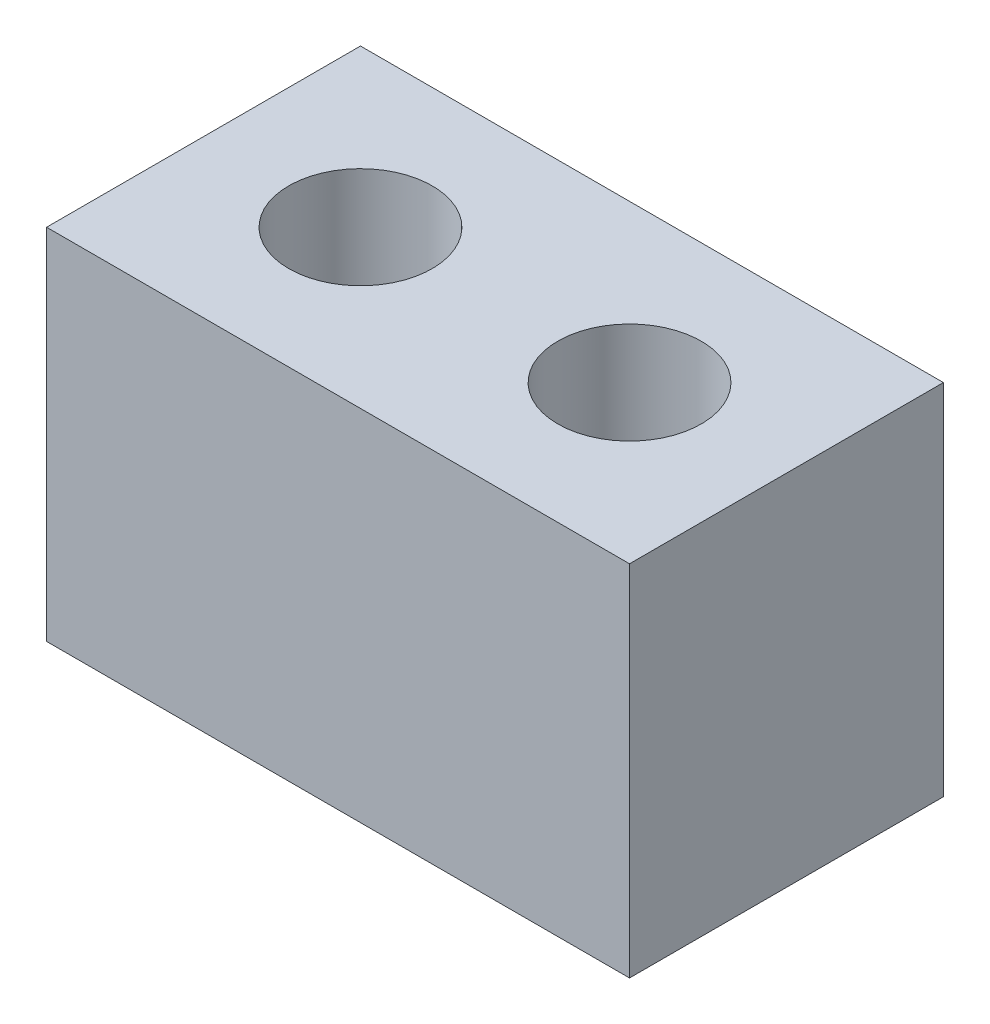
ISO-10303-21;
HEADER;
FILE_DESCRIPTION(('STEP AP214'),'2;1');
FILE_NAME('part.step','',(''),(''),'','','');
FILE_SCHEMA(('AUTOMOTIVE_DESIGN { 1 0 10303 214 1 1 1 1 }'));
ENDSEC;
DATA;
#1=APPLICATION_CONTEXT('core data for automotive mechanical design processes');
#2=APPLICATION_PROTOCOL_DEFINITION('international standard','automotive_design',2000,#1);
#3=PRODUCT_CONTEXT('',#1,'mechanical');
#4=PRODUCT('Part','Part','',(#3));
#5=PRODUCT_RELATED_PRODUCT_CATEGORY('part','',(#4));
#6=PRODUCT_DEFINITION_FORMATION('','',#4);
#7=PRODUCT_DEFINITION_CONTEXT('part definition',#1,'design');
#8=PRODUCT_DEFINITION('design','',#6,#7);
#9=PRODUCT_DEFINITION_SHAPE('','',#8);
#10=(LENGTH_UNIT() NAMED_UNIT(*) SI_UNIT(.MILLI.,.METRE.));
#11=(NAMED_UNIT(*) PLANE_ANGLE_UNIT() SI_UNIT($,.RADIAN.));
#12=(NAMED_UNIT(*) SI_UNIT($,.STERADIAN.) SOLID_ANGLE_UNIT());
#13=UNCERTAINTY_MEASURE_WITH_UNIT(LENGTH_MEASURE(1.E-05),#10,'distance_accuracy_value','');
#14=(GEOMETRIC_REPRESENTATION_CONTEXT(3) GLOBAL_UNCERTAINTY_ASSIGNED_CONTEXT((#13)) GLOBAL_UNIT_ASSIGNED_CONTEXT((#10,
#11,#12)) REPRESENTATION_CONTEXT('',''));
#15=CARTESIAN_POINT('',(0.,0.,0.));
#16=DIRECTION('',(0.,0.,1.));
#17=DIRECTION('',(1.,0.,0.));
#18=AXIS2_PLACEMENT_3D('',#15,#16,#17);
#19=CARTESIAN_POINT('',(0.,8.,0.));
#20=DIRECTION('',(0.,1.,0.));
#21=DIRECTION('',(0.,0.,1.));
#22=AXIS2_PLACEMENT_3D('',#19,#20,#21);
#23=PLANE('',#22);
#24=CARTESIAN_POINT('',(-3.,8.,0.));
#25=DIRECTION('',(0.,1.,0.));
#26=DIRECTION('',(0.,0.,1.));
#27=AXIS2_PLACEMENT_3D('',#24,#25,#26);
#28=CIRCLE('',#27,1.6);
#29=CARTESIAN_POINT('',(-3.,8.,1.6));
#30=VERTEX_POINT('',#29);
#31=EDGE_CURVE('E100',#30,#30,#28,.T.);
#32=ORIENTED_EDGE('',*,*,#31,.F.);
#33=EDGE_LOOP('',(#32));
#34=FACE_BOUND('',#33,.T.);
#35=DIRECTION('',(0.,0.,-1.));
#36=VECTOR('',#35,1.);
#37=CARTESIAN_POINT('',(6.5,8.,-3.5));
#38=LINE('',#37,#36);
#39=CARTESIAN_POINT('',(6.5,8.,3.5));
#40=VERTEX_POINT('',#39);
#41=CARTESIAN_POINT('',(6.5,8.,-3.5));
#42=VERTEX_POINT('',#41);
#43=EDGE_CURVE('E85',#40,#42,#38,.T.);
#44=ORIENTED_EDGE('',*,*,#43,.T.);
#45=DIRECTION('',(-1.,0.,0.));
#46=VECTOR('',#45,1.);
#47=CARTESIAN_POINT('',(-6.5,8.,-3.5));
#48=LINE('',#47,#46);
#49=CARTESIAN_POINT('',(-6.5,8.,-3.5));
#50=VERTEX_POINT('',#49);
#51=EDGE_CURVE('E80',#42,#50,#48,.T.);
#52=ORIENTED_EDGE('',*,*,#51,.T.);
#53=DIRECTION('',(0.,0.,1.));
#54=VECTOR('',#53,1.);
#55=CARTESIAN_POINT('',(-6.5,8.,-3.5));
#56=LINE('',#55,#54);
#57=CARTESIAN_POINT('',(-6.5,8.,3.5));
#58=VERTEX_POINT('',#57);
#59=EDGE_CURVE('E83',#50,#58,#56,.T.);
#60=ORIENTED_EDGE('',*,*,#59,.T.);
#61=DIRECTION('',(1.,0.,0.));
#62=VECTOR('',#61,1.);
#63=CARTESIAN_POINT('',(-6.5,8.,3.5));
#64=LINE('',#63,#62);
#65=EDGE_CURVE('E50',#58,#40,#64,.T.);
#66=ORIENTED_EDGE('',*,*,#65,.T.);
#67=EDGE_LOOP('',(#44,#52,#60,#66));
#68=FACE_BOUND('',#67,.T.);
#69=CARTESIAN_POINT('',(3.,8.,0.));
#70=DIRECTION('',(0.,1.,0.));
#71=DIRECTION('',(0.,0.,1.));
#72=AXIS2_PLACEMENT_3D('',#69,#70,#71);
#73=CIRCLE('',#72,1.6);
#74=CARTESIAN_POINT('',(3.,8.,1.6));
#75=VERTEX_POINT('',#74);
#76=EDGE_CURVE('E115',#75,#75,#73,.T.);
#77=ORIENTED_EDGE('',*,*,#76,.F.);
#78=EDGE_LOOP('',(#77));
#79=FACE_BOUND('',#78,.T.);
#80=ADVANCED_FACE('F33',(#34,#68,#79),#23,.T.);
#81=CARTESIAN_POINT('',(0.,0.,0.));
#82=DIRECTION('',(0.,1.,0.));
#83=DIRECTION('',(0.,0.,1.));
#84=AXIS2_PLACEMENT_3D('',#81,#82,#83);
#85=PLANE('',#84);
#86=DIRECTION('',(0.,0.,-1.));
#87=VECTOR('',#86,1.);
#88=CARTESIAN_POINT('',(6.5,0.,-3.5));
#89=LINE('',#88,#87);
#90=CARTESIAN_POINT('',(6.5,0.,3.5));
#91=VERTEX_POINT('',#90);
#92=CARTESIAN_POINT('',(6.5,0.,-3.5));
#93=VERTEX_POINT('',#92);
#94=EDGE_CURVE('E97',#91,#93,#89,.T.);
#95=ORIENTED_EDGE('',*,*,#94,.F.);
#96=DIRECTION('',(1.,0.,0.));
#97=VECTOR('',#96,1.);
#98=CARTESIAN_POINT('',(-6.5,0.,3.5));
#99=LINE('',#98,#97);
#100=CARTESIAN_POINT('',(-6.5,0.,3.5));
#101=VERTEX_POINT('',#100);
#102=EDGE_CURVE('E73',#101,#91,#99,.T.);
#103=ORIENTED_EDGE('',*,*,#102,.F.);
#104=DIRECTION('',(0.,0.,1.));
#105=VECTOR('',#104,1.);
#106=CARTESIAN_POINT('',(-6.5,0.,-3.5));
#107=LINE('',#106,#105);
#108=CARTESIAN_POINT('',(-6.5,0.,-3.5));
#109=VERTEX_POINT('',#108);
#110=EDGE_CURVE('E67',#109,#101,#107,.T.);
#111=ORIENTED_EDGE('',*,*,#110,.F.);
#112=DIRECTION('',(-1.,0.,0.));
#113=VECTOR('',#112,1.);
#114=CARTESIAN_POINT('',(-6.5,0.,-3.5));
#115=LINE('',#114,#113);
#116=EDGE_CURVE('E89',#93,#109,#115,.T.);
#117=ORIENTED_EDGE('',*,*,#116,.F.);
#118=EDGE_LOOP('',(#95,#103,#111,#117));
#119=FACE_BOUND('',#118,.T.);
#120=CARTESIAN_POINT('',(-3.,0.,0.));
#121=DIRECTION('',(0.,1.,0.));
#122=DIRECTION('',(0.,0.,1.));
#123=AXIS2_PLACEMENT_3D('',#120,#121,#122);
#124=CIRCLE('',#123,1.6);
#125=CARTESIAN_POINT('',(-3.,0.,1.6));
#126=VERTEX_POINT('',#125);
#127=EDGE_CURVE('E112',#126,#126,#124,.T.);
#128=ORIENTED_EDGE('',*,*,#127,.T.);
#129=EDGE_LOOP('',(#128));
#130=FACE_BOUND('',#129,.T.);
#131=CARTESIAN_POINT('',(3.,0.,0.));
#132=DIRECTION('',(0.,1.,0.));
#133=DIRECTION('',(0.,0.,1.));
#134=AXIS2_PLACEMENT_3D('',#131,#132,#133);
#135=CIRCLE('',#134,1.6);
#136=CARTESIAN_POINT('',(3.,0.,1.6));
#137=VERTEX_POINT('',#136);
#138=EDGE_CURVE('E118',#137,#137,#135,.T.);
#139=ORIENTED_EDGE('',*,*,#138,.T.);
#140=EDGE_LOOP('',(#139));
#141=FACE_BOUND('',#140,.T.);
#142=ADVANCED_FACE('F108',(#119,#130,#141),#85,.F.);
#143=CARTESIAN_POINT('',(6.5,8.,-3.5));
#144=DIRECTION('',(-1.,0.,0.));
#145=DIRECTION('',(0.,0.,1.));
#146=AXIS2_PLACEMENT_3D('',#143,#144,#145);
#147=PLANE('',#146);
#148=ORIENTED_EDGE('',*,*,#94,.T.);
#149=DIRECTION('',(0.,-1.,0.));
#150=VECTOR('',#149,1.);
#151=CARTESIAN_POINT('',(6.5,8.,-3.5));
#152=LINE('',#151,#150);
#153=EDGE_CURVE('E11',#42,#93,#152,.T.);
#154=ORIENTED_EDGE('',*,*,#153,.F.);
#155=ORIENTED_EDGE('',*,*,#43,.F.);
#156=DIRECTION('',(0.,-1.,0.));
#157=VECTOR('',#156,1.);
#158=CARTESIAN_POINT('',(6.5,8.,3.5));
#159=LINE('',#158,#157);
#160=EDGE_CURVE('E93',#40,#91,#159,.T.);
#161=ORIENTED_EDGE('',*,*,#160,.T.);
#162=EDGE_LOOP('',(#148,#154,#155,#161));
#163=FACE_BOUND('',#162,.T.);
#164=ADVANCED_FACE('F35',(#163),#147,.F.);
#165=CARTESIAN_POINT('',(-6.5,8.,-3.5));
#166=DIRECTION('',(0.,0.,1.));
#167=DIRECTION('',(1.,0.,0.));
#168=AXIS2_PLACEMENT_3D('',#165,#166,#167);
#169=PLANE('',#168);
#170=ORIENTED_EDGE('',*,*,#116,.T.);
#171=DIRECTION('',(0.,-1.,0.));
#172=VECTOR('',#171,1.);
#173=CARTESIAN_POINT('',(-6.5,8.,-3.5));
#174=LINE('',#173,#172);
#175=EDGE_CURVE('E42',#50,#109,#174,.T.);
#176=ORIENTED_EDGE('',*,*,#175,.F.);
#177=ORIENTED_EDGE('',*,*,#51,.F.);
#178=ORIENTED_EDGE('',*,*,#153,.T.);
#179=EDGE_LOOP('',(#170,#176,#177,#178));
#180=FACE_BOUND('',#179,.T.);
#181=ADVANCED_FACE('F88',(#180),#169,.F.);
#182=CARTESIAN_POINT('',(-6.5,8.,-3.5));
#183=DIRECTION('',(1.,0.,0.));
#184=DIRECTION('',(0.,0.,-1.));
#185=AXIS2_PLACEMENT_3D('',#182,#183,#184);
#186=PLANE('',#185);
#187=ORIENTED_EDGE('',*,*,#110,.T.);
#188=DIRECTION('',(0.,-1.,0.));
#189=VECTOR('',#188,1.);
#190=CARTESIAN_POINT('',(-6.5,8.,3.5));
#191=LINE('',#190,#189);
#192=EDGE_CURVE('E90',#58,#101,#191,.T.);
#193=ORIENTED_EDGE('',*,*,#192,.F.);
#194=ORIENTED_EDGE('',*,*,#59,.F.);
#195=ORIENTED_EDGE('',*,*,#175,.T.);
#196=EDGE_LOOP('',(#187,#193,#194,#195));
#197=FACE_BOUND('',#196,.T.);
#198=ADVANCED_FACE('F91',(#197),#186,.F.);
#199=CARTESIAN_POINT('',(-6.5,8.,3.5));
#200=DIRECTION('',(0.,0.,-1.));
#201=DIRECTION('',(-1.,0.,0.));
#202=AXIS2_PLACEMENT_3D('',#199,#200,#201);
#203=PLANE('',#202);
#204=ORIENTED_EDGE('',*,*,#102,.T.);
#205=ORIENTED_EDGE('',*,*,#160,.F.);
#206=ORIENTED_EDGE('',*,*,#65,.F.);
#207=ORIENTED_EDGE('',*,*,#192,.T.);
#208=EDGE_LOOP('',(#204,#205,#206,#207));
#209=FACE_BOUND('',#208,.T.);
#210=ADVANCED_FACE('F105',(#209),#203,.F.);
#211=CARTESIAN_POINT('',(-3.,8.,0.));
#212=DIRECTION('',(0.,-1.,0.));
#213=DIRECTION('',(0.,0.,-1.));
#214=AXIS2_PLACEMENT_3D('',#211,#212,#213);
#215=CYLINDRICAL_SURFACE('',#214,1.6);
#216=ORIENTED_EDGE('',*,*,#31,.T.);
#217=EDGE_LOOP('',(#216));
#218=FACE_BOUND('',#217,.T.);
#219=ORIENTED_EDGE('',*,*,#127,.F.);
#220=EDGE_LOOP('',(#219));
#221=FACE_BOUND('',#220,.T.);
#222=ADVANCED_FACE('F135',(#218,#221),#215,.F.);
#223=CARTESIAN_POINT('',(3.,8.,0.));
#224=DIRECTION('',(0.,-1.,0.));
#225=DIRECTION('',(0.,0.,-1.));
#226=AXIS2_PLACEMENT_3D('',#223,#224,#225);
#227=CYLINDRICAL_SURFACE('',#226,1.6);
#228=ORIENTED_EDGE('',*,*,#76,.T.);
#229=EDGE_LOOP('',(#228));
#230=FACE_BOUND('',#229,.T.);
#231=ORIENTED_EDGE('',*,*,#138,.F.);
#232=EDGE_LOOP('',(#231));
#233=FACE_BOUND('',#232,.T.);
#234=ADVANCED_FACE('F124',(#230,#233),#227,.F.);
#235=CLOSED_SHELL('',(#80,#142,#164,#181,#198,#210,#222,#234));
#236=MANIFOLD_SOLID_BREP('B2',#235);
#237=ADVANCED_BREP_SHAPE_REPRESENTATION('',(#18,#236),#14);
#238=SHAPE_DEFINITION_REPRESENTATION(#9,#237);
ENDSEC;
END-ISO-10303-21;
